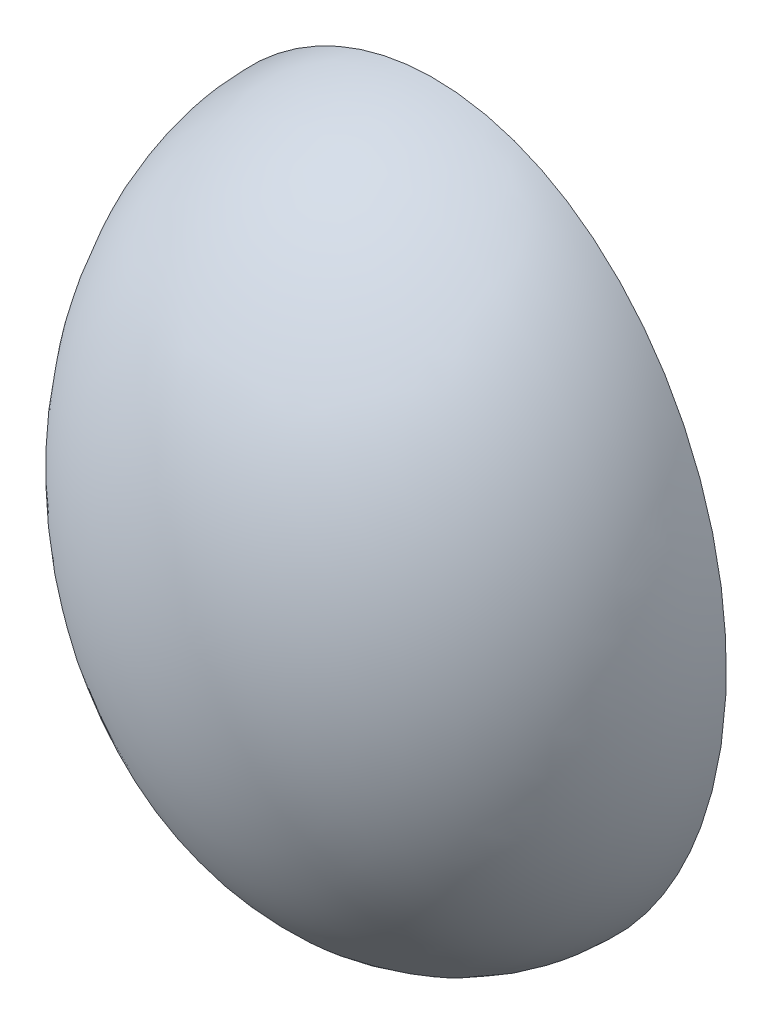
ISO-10303-21;
HEADER;
FILE_DESCRIPTION(('STEP AP214'),'2;1');
FILE_NAME('part.step','',(''),(''),'','','');
FILE_SCHEMA(('AUTOMOTIVE_DESIGN { 1 0 10303 214 1 1 1 1 }'));
ENDSEC;
DATA;
#1=APPLICATION_CONTEXT('core data for automotive mechanical design processes');
#2=APPLICATION_PROTOCOL_DEFINITION('international standard','automotive_design',2000,#1);
#3=PRODUCT_CONTEXT('',#1,'mechanical');
#4=PRODUCT('Part','Part','',(#3));
#5=PRODUCT_RELATED_PRODUCT_CATEGORY('part','',(#4));
#6=PRODUCT_DEFINITION_FORMATION('','',#4);
#7=PRODUCT_DEFINITION_CONTEXT('part definition',#1,'design');
#8=PRODUCT_DEFINITION('design','',#6,#7);
#9=PRODUCT_DEFINITION_SHAPE('','',#8);
#10=(LENGTH_UNIT() NAMED_UNIT(*) SI_UNIT(.MILLI.,.METRE.));
#11=(NAMED_UNIT(*) PLANE_ANGLE_UNIT() SI_UNIT($,.RADIAN.));
#12=(NAMED_UNIT(*) SI_UNIT($,.STERADIAN.) SOLID_ANGLE_UNIT());
#13=UNCERTAINTY_MEASURE_WITH_UNIT(LENGTH_MEASURE(1.E-05),#10,'distance_accuracy_value','');
#14=(GEOMETRIC_REPRESENTATION_CONTEXT(3) GLOBAL_UNCERTAINTY_ASSIGNED_CONTEXT((#13)) GLOBAL_UNIT_ASSIGNED_CONTEXT((#10,
#11,#12)) REPRESENTATION_CONTEXT('',''));
#15=CARTESIAN_POINT('',(0.,0.,0.));
#16=DIRECTION('',(0.,0.,1.));
#17=DIRECTION('',(1.,0.,0.));
#18=AXIS2_PLACEMENT_3D('',#15,#16,#17);
#19=CARTESIAN_POINT('',(0.,0.,0.));
#20=DIRECTION('',(0.,0.,1.));
#21=DIRECTION('',(1.,0.,0.));
#22=AXIS2_PLACEMENT_3D('',#19,#20,#21);
#23=PLANE('',#22);
#24=CARTESIAN_POINT('',(-40.,0.,-2.6628005356244E-13));
#25=CARTESIAN_POINT('',(-39.9999984871524,-1.72750049526673,-4.3858867054766E-13));
#26=CARTESIAN_POINT('',(-39.9283818942151,-3.45551992947665,-1.1751232533138E-13));
#27=CARTESIAN_POINT('',(-39.6414646392131,-6.90060177673713,1.17595918718897E-13));
#28=CARTESIAN_POINT('',(-39.4260618025095,-8.61765552098674,0.));
#29=CARTESIAN_POINT('',(-38.8504259710438,-12.027844209917,0.));
#30=CARTESIAN_POINT('',(-38.4901612549186,-13.7209738316614,0.));
#31=CARTESIAN_POINT('',(-37.6234984235841,-17.0684016586623,0.));
#32=CARTESIAN_POINT('',(-37.1172021737774,-18.7227260659379,0.));
#33=CARTESIAN_POINT('',(-36.0589138032748,-21.6915190082999,0.));
#34=CARTESIAN_POINT('',(-35.5307043870574,-23.0144958137103,0.));
#35=CARTESIAN_POINT('',(-34.3732434276229,-25.6141685994658,0.));
#36=CARTESIAN_POINT('',(-33.7440900525285,-26.8909080819009,0.));
#37=CARTESIAN_POINT('',(-32.3843063468385,-29.3873513667115,0.));
#38=CARTESIAN_POINT('',(-31.6537958396599,-30.6071202760141,0.));
#39=CARTESIAN_POINT('',(-30.0901723890382,-32.9794642384976,0.));
#40=CARTESIAN_POINT('',(-29.2570556001739,-34.1320367709435,0.));
#41=CARTESIAN_POINT('',(-27.6603061031861,-36.140567698509,0.));
#42=CARTESIAN_POINT('',(-26.9144943602611,-37.0107232117301,0.));
#43=CARTESIAN_POINT('',(-25.3575652344762,-38.6904964969656,0.));
#44=CARTESIAN_POINT('',(-24.5464584085491,-39.500124014506,0.));
#45=CARTESIAN_POINT('',(-22.860592040611,-41.0504382094156,0.));
#46=CARTESIAN_POINT('',(-21.9858270039936,-41.791118923092,0.));
#47=CARTESIAN_POINT('',(-20.1754107202322,-43.1944500129417,0.));
#48=CARTESIAN_POINT('',(-19.2397575468086,-43.8570979185752,0.));
#49=CARTESIAN_POINT('',(-17.6276739694625,-44.8921777580077,0.));
#50=CARTESIAN_POINT('',(-16.9665658200704,-45.2886379427715,0.));
#51=CARTESIAN_POINT('',(-15.6205468442622,-46.0390694509942,0.));
#52=CARTESIAN_POINT('',(-14.9356354107929,-46.393039689809,0.));
#53=CARTESIAN_POINT('',(-13.5441667897827,-47.0556499965219,0.));
#54=CARTESIAN_POINT('',(-12.8376086586493,-47.3642880849569,0.));
#55=CARTESIAN_POINT('',(-11.4061135856061,-47.9332880613119,0.));
#56=CARTESIAN_POINT('',(-10.6811960520068,-48.1936986939025,0.));
#57=CARTESIAN_POINT('',(-9.21519814348352,-48.6642312378271,0.));
#58=CARTESIAN_POINT('',(-8.47411811249608,-48.8743542181407,0.));
#59=CARTESIAN_POINT('',(-6.97926458775768,-49.2422295218969,0.));
#60=CARTESIAN_POINT('',(-6.22549393459686,-49.3999934055382,0.));
#61=CARTESIAN_POINT('',(-4.5024852255162,-49.6971294633596,0.));
#62=CARTESIAN_POINT('',(-3.5303247185089,-49.8198712040366,0.));
#63=CARTESIAN_POINT('',(-1.57900788780538,-49.9759729000274,0.));
#64=CARTESIAN_POINT('',(-0.599852394971114,-50.0093432994978,0.));
#65=CARTESIAN_POINT('',(1.35706347821817,-49.9861771589715,0.));
#66=CARTESIAN_POINT('',(2.33482422350475,-49.9296716531072,0.));
#67=CARTESIAN_POINT('',(4.28109750101994,-49.7277852597485,0.));
#68=CARTESIAN_POINT('',(5.24961021214668,-49.582406095018,0.));
#69=CARTESIAN_POINT('',(7.09607877623665,-49.2197118736815,0.));
#70=CARTESIAN_POINT('',(7.97529297193414,-49.0087527966368,0.));
#71=CARTESIAN_POINT('',(9.71358340081082,-48.5161130443756,0.));
#72=CARTESIAN_POINT('',(10.5726610431983,-48.2344373343464,0.));
#73=CARTESIAN_POINT('',(12.265816958816,-47.6040003042162,0.));
#74=CARTESIAN_POINT('',(13.0998941529474,-47.2552360931682,0.));
#75=CARTESIAN_POINT('',(14.7388410489995,-46.4948040932262,0.));
#76=CARTESIAN_POINT('',(15.5437091427388,-46.0831328473078,0.));
#77=CARTESIAN_POINT('',(17.1701948255709,-45.1737454775466,0.));
#78=CARTESIAN_POINT('',(17.9896994252037,-44.6722531426215,0.));
#79=CARTESIAN_POINT('',(19.5884877131011,-43.6089015157844,0.));
#80=CARTESIAN_POINT('',(20.3677701978753,-43.0470404191202,0.));
#81=CARTESIAN_POINT('',(21.8838421835912,-41.8683701676855,0.));
#82=CARTESIAN_POINT('',(22.6206199214521,-41.2515459210416,0.));
#83=CARTESIAN_POINT('',(24.0498350307998,-39.9683392148328,0.));
#84=CARTESIAN_POINT('',(24.7422666699053,-39.3019503722864,0.));
#85=CARTESIAN_POINT('',(25.7994173754808,-38.2148955912748,0.));
#86=CARTESIAN_POINT('',(26.1793649043978,-37.8089056367173,0.));
#87=CARTESIAN_POINT('',(26.9237421518783,-36.9830978314409,0.));
#88=CARTESIAN_POINT('',(27.2881749838788,-36.5632827853712,0.));
#89=CARTESIAN_POINT('',(28.3582371533518,-35.2842147039095,0.));
#90=CARTESIAN_POINT('',(29.0406195437249,-34.4053496889466,0.));
#91=CARTESIAN_POINT('',(30.3428828144196,-32.6021084792078,0.));
#92=CARTESIAN_POINT('',(30.962735696851,-31.6777121708479,0.));
#93=CARTESIAN_POINT('',(32.1396864223237,-29.7898138425317,0.));
#94=CARTESIAN_POINT('',(32.6967813506954,-28.8263100091279,0.));
#95=CARTESIAN_POINT('',(33.8542426045285,-26.6685842879165,0.));
#96=CARTESIAN_POINT('',(34.4407756105674,-25.4669351214446,0.));
#97=CARTESIAN_POINT('',(35.5244607206875,-23.0238131121175,0.));
#98=CARTESIAN_POINT('',(36.0215996390692,-21.7823344261487,0.));
#99=CARTESIAN_POINT('',(36.7009148904882,-19.8961138878458,0.));
#100=CARTESIAN_POINT('',(36.9163509020046,-19.2631498556277,0.));
#101=CARTESIAN_POINT('',(37.3251212782731,-17.9902855675009,0.));
#102=CARTESIAN_POINT('',(37.5184608681137,-17.3503869907339,0.));
#103=CARTESIAN_POINT('',(38.0656099623562,-15.4212228639157,0.));
#104=CARTESIAN_POINT('',(38.3865436325112,-14.1225060820542,0.));
#105=CARTESIAN_POINT('',(38.9928423771154,-11.2642196003617,0.));
#106=CARTESIAN_POINT('',(39.2605921839765,-9.70091355980892,0.));
#107=CARTESIAN_POINT('',(39.6748888886968,-6.55821021696601,0.));
#108=CARTESIAN_POINT('',(39.8214222363237,-4.9788111356802,0.));
#109=CARTESIAN_POINT('',(39.9939000695,-1.8120750822727,0.));
#110=CARTESIAN_POINT('',(40.0197359667821,-0.224732247909333,0.));
#111=CARTESIAN_POINT('',(39.9506042702291,2.9475187246836,0.));
#112=CARTESIAN_POINT('',(39.855634688728,4.53242682242378,0.));
#113=CARTESIAN_POINT('',(39.6145911008552,6.9791939336742,0.));
#114=CARTESIAN_POINT('',(39.5107579030316,7.84541687940216,0.));
#115=CARTESIAN_POINT('',(39.2663406666413,9.57263863041582,0.));
#116=CARTESIAN_POINT('',(39.1257596652698,10.4336378614253,0.));
#117=CARTESIAN_POINT('',(38.8076787698456,12.1488212357455,0.));
#118=CARTESIAN_POINT('',(38.6301780266998,13.0030052218476,0.));
#119=CARTESIAN_POINT('',(38.238010632888,14.7030853848675,0.));
#120=CARTESIAN_POINT('',(38.0233299807864,15.5489783122307,0.));
#121=CARTESIAN_POINT('',(37.3236925572357,18.0695372742679,0.));
#122=CARTESIAN_POINT('',(36.7827776873616,19.7290523737874,0.));
#123=CARTESIAN_POINT('',(35.5498355892948,22.990839382403,0.));
#124=CARTESIAN_POINT('',(34.857853074302,24.5931280665096,0.));
#125=CARTESIAN_POINT('',(33.7999513500114,26.7473730738442,0.));
#126=CARTESIAN_POINT('',(33.4993792455767,27.3319575092375,0.));
#127=CARTESIAN_POINT('',(32.8764852946956,28.4892499100715,0.));
#128=CARTESIAN_POINT('',(32.5541689385369,29.0619608261111,0.));
#129=CARTESIAN_POINT('',(31.5543910777143,30.7608073427151,0.));
#130=CARTESIAN_POINT('',(30.8440200527197,31.867821805844,0.));
#131=CARTESIAN_POINT('',(29.3363862076241,34.0193770742448,0.));
#132=CARTESIAN_POINT('',(28.5392246800777,35.0639885495727,0.));
#133=CARTESIAN_POINT('',(27.2786923287669,36.5763804689445,0.));
#134=CARTESIAN_POINT('',(26.8477282150131,37.0714117684794,0.));
#135=CARTESIAN_POINT('',(25.9641887872415,38.0420588792671,0.));
#136=CARTESIAN_POINT('',(25.5116078462745,38.5176695748352,0.));
#137=CARTESIAN_POINT('',(24.2895754710273,39.7445674697488,0.));
#138=CARTESIAN_POINT('',(23.5021837156449,40.4781383710437,0.));
#139=CARTESIAN_POINT('',(21.872281877537,41.881191249092,0.));
#140=CARTESIAN_POINT('',(21.0297830491554,42.5506862434963,0.));
#141=CARTESIAN_POINT('',(19.7269769768328,43.5010678723742,0.));
#142=CARTESIAN_POINT('',(19.2861469641992,43.8089164743686,0.));
#143=CARTESIAN_POINT('',(18.3919187904551,44.4056954195217,0.));
#144=CARTESIAN_POINT('',(17.9385225961829,44.6946286997397,0.));
#145=CARTESIAN_POINT('',(17.0195989892992,45.252662595125,0.));
#146=CARTESIAN_POINT('',(16.5540699873266,45.521760594075,0.));
#147=CARTESIAN_POINT('',(15.6115893799172,46.0390999498578,0.));
#148=CARTESIAN_POINT('',(15.1346381358459,46.2873419653943,0.));
#149=CARTESIAN_POINT('',(14.0042596611149,46.8435829838015,0.));
#150=CARTESIAN_POINT('',(13.3464902568199,47.1428173082722,0.));
#151=CARTESIAN_POINT('',(12.0135622170569,47.6997145086551,0.));
#152=CARTESIAN_POINT('',(11.3384030956979,47.9573762215104,0.));
#153=CARTESIAN_POINT('',(9.97297317277158,48.4290955466221,0.));
#154=CARTESIAN_POINT('',(9.28270204025656,48.6431522028829,0.));
#155=CARTESIAN_POINT('',(7.89015738727008,49.0257151766041,0.));
#156=CARTESIAN_POINT('',(7.18789263566383,49.194253375451,0.));
#157=CARTESIAN_POINT('',(5.77372856687724,49.4844897113597,0.));
#158=CARTESIAN_POINT('',(5.06182931677296,49.6061881743497,0.));
#159=CARTESIAN_POINT('',(3.63162881406742,49.8016191907783,0.));
#160=CARTESIAN_POINT('',(2.91332866913693,49.8753598859345,0.));
#161=CARTESIAN_POINT('',(1.2534156445457,49.9892863729781,0.));
#162=CARTESIAN_POINT('',(0.31057441535365,50.0123554836086,0.));
#163=CARTESIAN_POINT('',(-1.57330084755433,49.9751868803933,0.));
#164=CARTESIAN_POINT('',(-2.51433505415143,49.9149575788774,0.));
#165=CARTESIAN_POINT('',(-4.38731952128871,49.7122158930565,0.));
#166=CARTESIAN_POINT('',(-5.31927135054619,49.5697179839042,0.));
#167=CARTESIAN_POINT('',(-7.16733742352761,49.2046824929894,0.));
#168=CARTESIAN_POINT('',(-8.08345148419391,48.9821439867412,0.));
#169=CARTESIAN_POINT('',(-9.86037016634834,48.4699308414827,0.));
#170=CARTESIAN_POINT('',(-10.721972062556,48.1830105008538,0.));
#171=CARTESIAN_POINT('',(-12.4196181802235,47.5417479298396,0.));
#172=CARTESIAN_POINT('',(-13.2556633890574,47.1874083080061,0.));
#173=CARTESIAN_POINT('',(-14.8981119913057,46.4155174263695,0.));
#174=CARTESIAN_POINT('',(-15.7045114805266,45.9979578776159,0.));
#175=CARTESIAN_POINT('',(-17.2841229960461,45.1042340158271,0.));
#176=CARTESIAN_POINT('',(-18.0573331521334,44.6280664060728,0.));
#177=CARTESIAN_POINT('',(-19.6378896901469,43.5751477409685,0.));
#178=CARTESIAN_POINT('',(-20.44174914907,42.9931636680277,0.));
#179=CARTESIAN_POINT('',(-22.0038374628093,41.7709592074935,0.));
#180=CARTESIAN_POINT('',(-22.7620640500919,41.1307359299112,0.));
#181=CARTESIAN_POINT('',(-24.2311486331435,39.7978394641713,0.));
#182=CARTESIAN_POINT('',(-24.9419946813354,39.1051531401855,0.));
#183=CARTESIAN_POINT('',(-26.3149986093712,37.6729426822767,0.));
#184=CARTESIAN_POINT('',(-26.9771501427729,36.9334124664028,0.));
#185=CARTESIAN_POINT('',(-27.9886208957096,35.7269297699276,0.));
#186=CARTESIAN_POINT('',(-28.3542225618456,35.2735071609223,0.));
#187=CARTESIAN_POINT('',(-29.0682069962655,34.3534517842902,0.));
#188=CARTESIAN_POINT('',(-29.4165930763766,33.8868215848364,0.));
#189=CARTESIAN_POINT('',(-30.4360562455761,32.4682701701724,0.));
#190=CARTESIAN_POINT('',(-31.0814208400292,31.4977090037454,0.));
#191=CARTESIAN_POINT('',(-32.303740284661,29.5135777368213,0.));
#192=CARTESIAN_POINT('',(-32.8806399472958,28.4999738224483,0.));
#193=CARTESIAN_POINT('',(-33.9658510529135,26.4367318168379,0.));
#194=CARTESIAN_POINT('',(-34.4741603883175,25.3870926195849,0.));
#195=CARTESIAN_POINT('',(-35.5194713297596,23.0402221518588,0.));
#196=CARTESIAN_POINT('',(-36.0411741266596,21.7361620949499,0.));
#197=CARTESIAN_POINT('',(-36.9869517641171,19.0929947080405,0.));
#198=CARTESIAN_POINT('',(-37.4110092394704,17.7538811912325,0.));
#199=CARTESIAN_POINT('',(-38.1620951854827,15.050126960751,0.));
#200=CARTESIAN_POINT('',(-38.4892120221335,13.6855107080123,0.));
#201=CARTESIAN_POINT('',(-39.0477880250788,10.9370660704492,0.));
#202=CARTESIAN_POINT('',(-39.2792674276725,9.55324181403877,0.));
#203=CARTESIAN_POINT('',(-39.5528252545567,7.48695735091982,0.));
#204=CARTESIAN_POINT('',(-39.6311333384306,6.80909849657666,0.));
#205=CARTESIAN_POINT('',(-39.7653133963708,5.45137189739393,0.));
#206=CARTESIAN_POINT('',(-39.8211930825457,4.77150492419868,0.));
#207=CARTESIAN_POINT('',(-39.9105878257835,3.41032643282853,0.));
#208=CARTESIAN_POINT('',(-39.9441037483333,2.72901497157972,0.));
#209=CARTESIAN_POINT('',(-39.9888189576152,1.36516304700555,0.));
#210=CARTESIAN_POINT('',(-40.0000005978019,0.682622038005846,-1.98192281886138E-13));
#211=CARTESIAN_POINT('',(-40.,0.,-2.6628005356244E-13));
#212=B_SPLINE_CURVE_WITH_KNOTS('',3,(#24,#25,#26,#27,#28,#29,#30,#31,#32,#33,#34,#35,#36,#37,
#38,#39,#40,#41,#42,#43,#44,#45,#46,#47,#48,#49,#50,#51,#52,#53,#54,#55,#56,#57,#58,#59,#60,#61,
#62,#63,#64,#65,#66,#67,#68,#69,#70,#71,#72,#73,#74,#75,#76,#77,#78,#79,#80,#81,#82,#83,#84,#85,
#86,#87,#88,#89,#90,#91,#92,#93,#94,#95,#96,#97,#98,#99,#100,#101,#102,#103,#104,#105,#106,#107,
#108,#109,#110,#111,#112,#113,#114,#115,#116,#117,#118,#119,#120,#121,#122,#123,#124,#125,#126,
#127,#128,#129,#130,#131,#132,#133,#134,#135,#136,#137,#138,#139,#140,#141,#142,#143,#144,#145,
#146,#147,#148,#149,#150,#151,#152,#153,#154,#155,#156,#157,#158,#159,#160,#161,#162,#163,#164,
#165,#166,#167,#168,#169,#170,#171,#172,#173,#174,#175,#176,#177,#178,#179,#180,#181,#182,#183,
#184,#185,#186,#187,#188,#189,#190,#191,#192,#193,#194,#195,#196,#197,#198,#199,#200,#201,#202,
#203,#204,#205,#206,#207,#208,#209,#210,#211),.UNSPECIFIED.,.T.,.F.,(4,2,2,2,2,2,2,2,2,2,2,2,2,
2,2,2,2,2,2,2,2,2,2,2,2,2,2,2,2,2,2,2,2,2,2,2,2,2,2,2,2,2,2,2,2,2,2,2,2,2,2,2,2,2,2,2,2,2,2,2,2,
2,2,2,2,2,2,2,2,2,2,2,2,2,2,2,2,2,2,2,2,2,2,2,2,2,2,2,2,2,2,2,2,4),(0.,5.18191161505921,
10.3675094268173,15.5542433821285,20.737368005927,25.0069394258039,29.2723835730558,
33.5328274501565,37.7934310464266,41.2283899698521,44.6627946389981,48.0974960983848,
51.5323062721271,53.8435475699589,56.1548478544892,58.4662490337375,60.7753011190056,
63.0843041157059,65.3927969752875,68.3282220736225,71.2633041159299,74.1973728949906,
77.131384800648,79.8408797298439,82.5501844719687,85.2596059883719,87.969176453249,
90.8486052114587,93.7281200754998,96.6084280524151,99.4891076028568,101.156894095056,
102.824344308467,106.159290415521,109.495723194098,112.8323108629,116.839989733124,
120.848259255155,122.853784005588,124.858833528788,128.868987165113,133.622346829155,
138.376237777709,143.134404852181,147.892650215895,150.509250500345,153.125634591887,
155.742078862601,158.359510600849,163.588389232395,168.815722306798,170.787342953849,
172.758467628857,176.700167130183,180.63731464183,182.605789159752,184.574778902332,
187.800004476718,191.0245734177,192.63722001912,194.249615621475,195.862223515089,
197.474780457847,199.641259001147,201.807798144468,203.974384781803,206.139449970823,
208.304500094252,210.469182564388,213.294718900151,216.119969905042,218.944723958754,
221.769510640015,224.490943575128,227.212271235373,229.933956006371,232.655793942889,
235.630118934542,238.604591600951,241.579811501099,244.555418482212,246.302420513247,
248.049085148024,251.542495768093,255.038703466729,258.535018569093,262.744547340877,
266.954824156352,271.161251215615,275.366787764111,277.413588445498,279.459684720781,
281.505701806699,283.553334833219),.UNSPECIFIED.);
#213=CARTESIAN_POINT('',(-40.,0.,-2.6628005356244E-13));
#214=VERTEX_POINT('',#213);
#215=EDGE_CURVE('E11',#214,#214,#212,.T.);
#216=ORIENTED_EDGE('',*,*,#215,.F.);
#217=EDGE_LOOP('',(#216));
#218=FACE_BOUND('',#217,.T.);
#219=ADVANCED_FACE('F37',(#218),#23,.F.);
#220=CARTESIAN_POINT('',(0.,0.,35.));
#221=CARTESIAN_POINT('',(0.,0.,35.));
#222=CARTESIAN_POINT('',(0.,0.,35.));
#223=CARTESIAN_POINT('',(0.,0.,35.));
#224=CARTESIAN_POINT('',(0.,0.,35.));
#225=CARTESIAN_POINT('',(0.,0.,35.));
#226=CARTESIAN_POINT('',(0.,0.,35.));
#227=CARTESIAN_POINT('',(-80.,0.,35.));
#228=CARTESIAN_POINT('',(-80.,-200.,35.));
#229=CARTESIAN_POINT('',(80.,-200.,35.));
#230=CARTESIAN_POINT('',(80.,0.,35.));
#231=CARTESIAN_POINT('',(80.,200.,35.));
#232=CARTESIAN_POINT('',(-80.,200.,35.));
#233=CARTESIAN_POINT('',(-80.,0.,35.));
#234=CARTESIAN_POINT('',(-80.,0.,-35.));
#235=CARTESIAN_POINT('',(-80.,-200.,-35.));
#236=CARTESIAN_POINT('',(80.,-200.,-35.));
#237=CARTESIAN_POINT('',(80.,0.,-35.));
#238=CARTESIAN_POINT('',(80.,200.,-35.));
#239=CARTESIAN_POINT('',(-80.,200.,-35.));
#240=CARTESIAN_POINT('',(-80.,0.,-35.));
#241=CARTESIAN_POINT('',(0.,0.,-35.));
#242=CARTESIAN_POINT('',(0.,0.,-35.));
#243=CARTESIAN_POINT('',(0.,0.,-35.));
#244=CARTESIAN_POINT('',(0.,0.,-35.));
#245=CARTESIAN_POINT('',(0.,0.,-35.));
#246=CARTESIAN_POINT('',(0.,0.,-35.));
#247=CARTESIAN_POINT('',(0.,0.,-35.));
#248=(BOUNDED_SURFACE() B_SPLINE_SURFACE(3,3,((#220,#221,#222,#223,#224,#225,#226),(#227,#228,
#229,#230,#231,#232,#233),(#234,#235,#236,#237,#238,#239,#240),(#241,#242,#243,#244,#245,#246,
#247)),.UNSPECIFIED.,.F.,.T.,.F.) B_SPLINE_SURFACE_WITH_KNOTS((4,4),(4,3,4),(0.,1.),(0.,0.5,1.),
.UNSPECIFIED.) GEOMETRIC_REPRESENTATION_ITEM() RATIONAL_B_SPLINE_SURFACE(((1.,0.333333333333333,
0.333333333333333,1.,0.333333333333333,0.333333333333333,1.),(0.333333333333333,
0.111111111111111,0.111111111111111,0.333333333333333,0.111111111111111,0.111111111111111,
0.333333333333333),(0.333333333333333,0.111111111111111,0.111111111111111,0.333333333333333,
0.111111111111111,0.111111111111111,0.333333333333333),(1.,0.333333333333333,0.333333333333333,
1.,0.333333333333333,0.333333333333333,1.))) REPRESENTATION_ITEM('') SURFACE());
#249=ORIENTED_EDGE('',*,*,#215,.T.);
#250=EDGE_LOOP('',(#249));
#251=FACE_BOUND('',#250,.T.);
#252=CARTESIAN_POINT('',(0.,0.,35.));
#253=VERTEX_POINT('',#252);
#254=VERTEX_LOOP('',#253);
#255=FACE_BOUND('',#254,.T.);
#256=ADVANCED_FACE('F47',(#251,#255),#248,.T.);
#257=CLOSED_SHELL('',(#219,#256));
#258=MANIFOLD_SOLID_BREP('B2',#257);
#259=ADVANCED_BREP_SHAPE_REPRESENTATION('',(#18,#258),#14);
#260=SHAPE_DEFINITION_REPRESENTATION(#9,#259);
ENDSEC;
END-ISO-10303-21;
